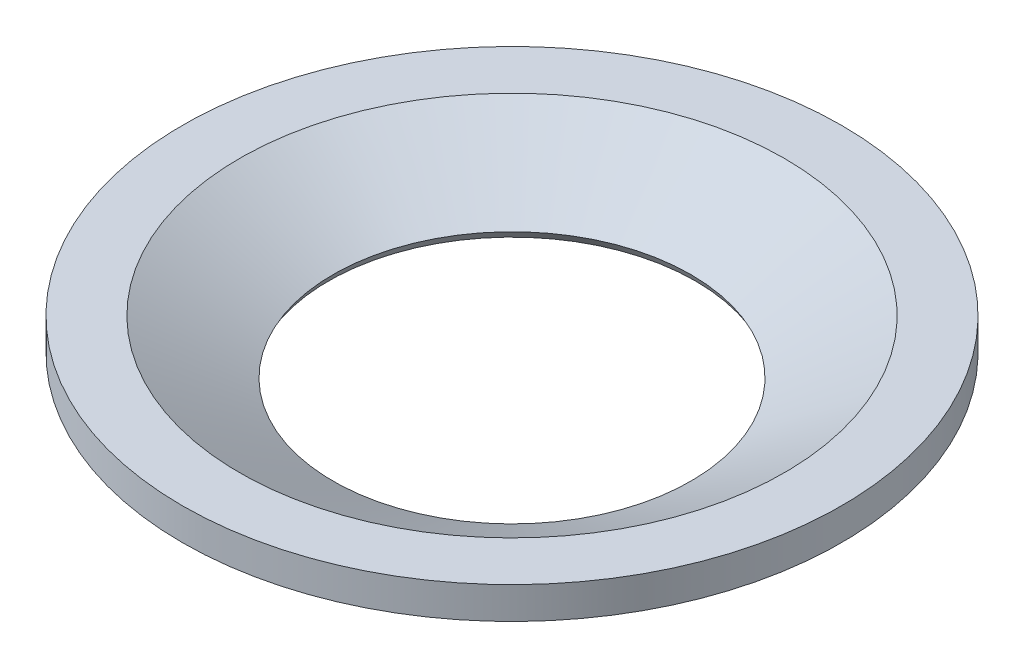
ISO-10303-21;
HEADER;
FILE_DESCRIPTION(('STEP AP214'),'2;1');
FILE_NAME('part.step','',(''),(''),'','','');
FILE_SCHEMA(('AUTOMOTIVE_DESIGN { 1 0 10303 214 1 1 1 1 }'));
ENDSEC;
DATA;
#1=APPLICATION_CONTEXT('core data for automotive mechanical design processes');
#2=APPLICATION_PROTOCOL_DEFINITION('international standard','automotive_design',2000,#1);
#3=PRODUCT_CONTEXT('',#1,'mechanical');
#4=PRODUCT('Part','Part','',(#3));
#5=PRODUCT_RELATED_PRODUCT_CATEGORY('part','',(#4));
#6=PRODUCT_DEFINITION_FORMATION('','',#4);
#7=PRODUCT_DEFINITION_CONTEXT('part definition',#1,'design');
#8=PRODUCT_DEFINITION('design','',#6,#7);
#9=PRODUCT_DEFINITION_SHAPE('','',#8);
#10=(LENGTH_UNIT() NAMED_UNIT(*) SI_UNIT(.MILLI.,.METRE.));
#11=(NAMED_UNIT(*) PLANE_ANGLE_UNIT() SI_UNIT($,.RADIAN.));
#12=(NAMED_UNIT(*) SI_UNIT($,.STERADIAN.) SOLID_ANGLE_UNIT());
#13=UNCERTAINTY_MEASURE_WITH_UNIT(LENGTH_MEASURE(1.E-05),#10,'distance_accuracy_value','');
#14=(GEOMETRIC_REPRESENTATION_CONTEXT(3) GLOBAL_UNCERTAINTY_ASSIGNED_CONTEXT((#13)) GLOBAL_UNIT_ASSIGNED_CONTEXT((#10,
#11,#12)) REPRESENTATION_CONTEXT('',''));
#15=CARTESIAN_POINT('',(0.,0.,0.));
#16=DIRECTION('',(0.,0.,1.));
#17=DIRECTION('',(1.,0.,0.));
#18=AXIS2_PLACEMENT_3D('',#15,#16,#17);
#19=CARTESIAN_POINT('',(0.,0.,0.));
#20=DIRECTION('',(0.,-1.,0.));
#21=DIRECTION('',(0.,0.,-1.));
#22=AXIS2_PLACEMENT_3D('',#19,#20,#21);
#23=CYLINDRICAL_SURFACE('',#22,45.847);
#24=CARTESIAN_POINT('',(0.,-3.175,0.));
#25=DIRECTION('',(0.,-1.,0.));
#26=DIRECTION('',(0.,0.,-1.));
#27=AXIS2_PLACEMENT_3D('',#24,#25,#26);
#28=CIRCLE('',#27,45.847);
#29=CARTESIAN_POINT('',(0.,-3.175,-45.847));
#30=VERTEX_POINT('',#29);
#31=EDGE_CURVE('E10',#30,#30,#28,.T.);
#32=ORIENTED_EDGE('',*,*,#31,.F.);
#33=EDGE_LOOP('',(#32));
#34=FACE_BOUND('',#33,.T.);
#35=CARTESIAN_POINT('',(0.,1.27,0.));
#36=DIRECTION('',(0.,-1.,0.));
#37=DIRECTION('',(0.,0.,-1.));
#38=AXIS2_PLACEMENT_3D('',#35,#36,#37);
#39=CIRCLE('',#38,45.847);
#40=CARTESIAN_POINT('',(0.,1.27,-45.847));
#41=VERTEX_POINT('',#40);
#42=EDGE_CURVE('E78',#41,#41,#39,.T.);
#43=ORIENTED_EDGE('',*,*,#42,.T.);
#44=EDGE_LOOP('',(#43));
#45=FACE_BOUND('',#44,.T.);
#46=ADVANCED_FACE('F43',(#34,#45),#23,.T.);
#47=CARTESIAN_POINT('',(-44.577,-3.175,0.));
#48=DIRECTION('',(0.,-1.,0.));
#49=DIRECTION('',(0.,0.,-1.));
#50=AXIS2_PLACEMENT_3D('',#47,#48,#49);
#51=PLANE('',#50);
#52=ORIENTED_EDGE('',*,*,#31,.T.);
#53=EDGE_LOOP('',(#52));
#54=FACE_BOUND('',#53,.T.);
#55=CARTESIAN_POINT('',(0.,-3.175,0.));
#56=DIRECTION('',(0.,-1.,0.));
#57=DIRECTION('',(0.,0.,-1.));
#58=AXIS2_PLACEMENT_3D('',#55,#56,#57);
#59=CIRCLE('',#58,44.577);
#60=CARTESIAN_POINT('',(0.,-3.175,-44.577));
#61=VERTEX_POINT('',#60);
#62=EDGE_CURVE('E50',#61,#61,#59,.T.);
#63=ORIENTED_EDGE('',*,*,#62,.F.);
#64=EDGE_LOOP('',(#63));
#65=FACE_BOUND('',#64,.T.);
#66=ADVANCED_FACE('F108',(#54,#65),#51,.T.);
#67=CARTESIAN_POINT('',(0.,0.,0.));
#68=DIRECTION('',(0.,-1.,0.));
#69=DIRECTION('',(0.,0.,-1.));
#70=AXIS2_PLACEMENT_3D('',#67,#68,#69);
#71=CYLINDRICAL_SURFACE('',#70,44.577);
#72=ORIENTED_EDGE('',*,*,#62,.T.);
#73=EDGE_LOOP('',(#72));
#74=FACE_BOUND('',#73,.T.);
#75=CARTESIAN_POINT('',(0.,0.,0.));
#76=DIRECTION('',(0.,-1.,0.));
#77=DIRECTION('',(0.,0.,-1.));
#78=AXIS2_PLACEMENT_3D('',#75,#76,#77);
#79=CIRCLE('',#78,44.577);
#80=CARTESIAN_POINT('',(0.,0.,-44.577));
#81=VERTEX_POINT('',#80);
#82=EDGE_CURVE('E55',#81,#81,#79,.T.);
#83=ORIENTED_EDGE('',*,*,#82,.F.);
#84=EDGE_LOOP('',(#83));
#85=FACE_BOUND('',#84,.T.);
#86=ADVANCED_FACE('F113',(#74,#85),#71,.F.);
#87=CARTESIAN_POINT('',(-44.577,0.,0.));
#88=DIRECTION('',(0.,-1.,0.));
#89=DIRECTION('',(0.,0.,-1.));
#90=AXIS2_PLACEMENT_3D('',#87,#88,#89);
#91=PLANE('',#90);
#92=ORIENTED_EDGE('',*,*,#82,.T.);
#93=EDGE_LOOP('',(#92));
#94=FACE_BOUND('',#93,.T.);
#95=CARTESIAN_POINT('',(0.,0.,0.));
#96=DIRECTION('',(0.,-1.,0.));
#97=DIRECTION('',(0.,0.,-1.));
#98=AXIS2_PLACEMENT_3D('',#95,#96,#97);
#99=CIRCLE('',#98,38.227);
#100=CARTESIAN_POINT('',(0.,0.,-38.227));
#101=VERTEX_POINT('',#100);
#102=EDGE_CURVE('E60',#101,#101,#99,.T.);
#103=ORIENTED_EDGE('',*,*,#102,.F.);
#104=EDGE_LOOP('',(#103));
#105=FACE_BOUND('',#104,.T.);
#106=ADVANCED_FACE('F104',(#94,#105),#91,.T.);
#107=CARTESIAN_POINT('',(0.,-7.33234841870827,0.));
#108=DIRECTION('',(0.,1.,0.));
#109=DIRECTION('',(0.,0.,1.));
#110=AXIS2_PLACEMENT_3D('',#107,#108,#109);
#111=CONICAL_SURFACE('',#110,25.527,1.0471975511966);
#112=ORIENTED_EDGE('',*,*,#102,.T.);
#113=EDGE_LOOP('',(#112));
#114=FACE_BOUND('',#113,.T.);
#115=CARTESIAN_POINT('',(0.,-7.33234841870827,0.));
#116=DIRECTION('',(0.,-1.,0.));
#117=DIRECTION('',(0.,0.,-1.));
#118=AXIS2_PLACEMENT_3D('',#115,#116,#117);
#119=CIRCLE('',#118,25.527);
#120=CARTESIAN_POINT('',(0.,-7.33234841870827,-25.527));
#121=VERTEX_POINT('',#120);
#122=EDGE_CURVE('E66',#121,#121,#119,.T.);
#123=ORIENTED_EDGE('',*,*,#122,.F.);
#124=EDGE_LOOP('',(#123));
#125=FACE_BOUND('',#124,.T.);
#126=ADVANCED_FACE('F98',(#114,#125),#111,.T.);
#127=CARTESIAN_POINT('',(0.,-6.23249615590204,0.));
#128=DIRECTION('',(0.,-1.,0.));
#129=DIRECTION('',(0.,0.,-1.));
#130=AXIS2_PLACEMENT_3D('',#127,#128,#129);
#131=CONICAL_SURFACE('',#130,24.892,0.523598775598306);
#132=ORIENTED_EDGE('',*,*,#122,.T.);
#133=EDGE_LOOP('',(#132));
#134=FACE_BOUND('',#133,.T.);
#135=CARTESIAN_POINT('',(0.,-6.23249615590204,0.));
#136=DIRECTION('',(0.,-1.,0.));
#137=DIRECTION('',(0.,0.,-1.));
#138=AXIS2_PLACEMENT_3D('',#135,#136,#137);
#139=CIRCLE('',#138,24.892);
#140=CARTESIAN_POINT('',(0.,-6.23249615590204,-24.892));
#141=VERTEX_POINT('',#140);
#142=EDGE_CURVE('E70',#141,#141,#139,.T.);
#143=ORIENTED_EDGE('',*,*,#142,.F.);
#144=EDGE_LOOP('',(#143));
#145=FACE_BOUND('',#144,.T.);
#146=ADVANCED_FACE('F93',(#134,#145),#131,.F.);
#147=CARTESIAN_POINT('',(0.,-6.23249615590204,0.));
#148=DIRECTION('',(0.,1.,0.));
#149=DIRECTION('',(0.,0.,1.));
#150=AXIS2_PLACEMENT_3D('',#147,#148,#149);
#151=CONICAL_SURFACE('',#150,24.892,1.0471975511966);
#152=CARTESIAN_POINT('',(0.,1.27,0.));
#153=DIRECTION('',(0.,-1.,0.));
#154=DIRECTION('',(0.,0.,-1.));
#155=AXIS2_PLACEMENT_3D('',#152,#153,#154);
#156=CIRCLE('',#155,37.8867045256125);
#157=CARTESIAN_POINT('',(0.,1.27,-37.8867045256125));
#158=VERTEX_POINT('',#157);
#159=EDGE_CURVE('E74',#158,#158,#156,.T.);
#160=ORIENTED_EDGE('',*,*,#159,.F.);
#161=EDGE_LOOP('',(#160));
#162=FACE_BOUND('',#161,.T.);
#163=ORIENTED_EDGE('',*,*,#142,.T.);
#164=EDGE_LOOP('',(#163));
#165=FACE_BOUND('',#164,.T.);
#166=ADVANCED_FACE('F87',(#162,#165),#151,.F.);
#167=CARTESIAN_POINT('',(-44.577,1.27,0.));
#168=DIRECTION('',(0.,-1.,0.));
#169=DIRECTION('',(0.,0.,-1.));
#170=AXIS2_PLACEMENT_3D('',#167,#168,#169);
#171=PLANE('',#170);
#172=ORIENTED_EDGE('',*,*,#42,.F.);
#173=EDGE_LOOP('',(#172));
#174=FACE_BOUND('',#173,.T.);
#175=ORIENTED_EDGE('',*,*,#159,.T.);
#176=EDGE_LOOP('',(#175));
#177=FACE_BOUND('',#176,.T.);
#178=ADVANCED_FACE('F84',(#174,#177),#171,.F.);
#179=CLOSED_SHELL('',(#46,#66,#86,#106,#126,#146,#166,#178));
#180=MANIFOLD_SOLID_BREP('B2',#179);
#181=ADVANCED_BREP_SHAPE_REPRESENTATION('',(#18,#180),#14);
#182=SHAPE_DEFINITION_REPRESENTATION(#9,#181);
ENDSEC;
END-ISO-10303-21;
